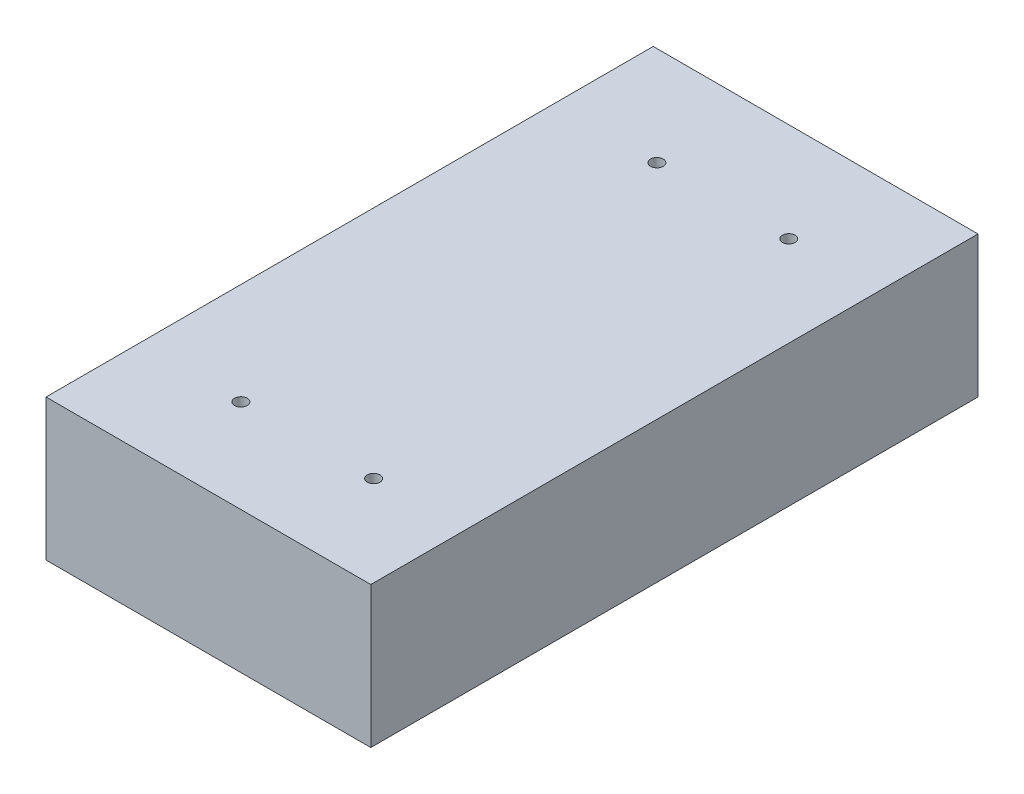
ISO-10303-21;
HEADER;
FILE_DESCRIPTION(('STEP AP214'),'2;1');
FILE_NAME('part.step','',(''),(''),'','','');
FILE_SCHEMA(('AUTOMOTIVE_DESIGN { 1 0 10303 214 1 1 1 1 }'));
ENDSEC;
DATA;
#1=APPLICATION_CONTEXT('core data for automotive mechanical design processes');
#2=APPLICATION_PROTOCOL_DEFINITION('international standard','automotive_design',2000,#1);
#3=PRODUCT_CONTEXT('',#1,'mechanical');
#4=PRODUCT('Part','Part','',(#3));
#5=PRODUCT_RELATED_PRODUCT_CATEGORY('part','',(#4));
#6=PRODUCT_DEFINITION_FORMATION('','',#4);
#7=PRODUCT_DEFINITION_CONTEXT('part definition',#1,'design');
#8=PRODUCT_DEFINITION('design','',#6,#7);
#9=PRODUCT_DEFINITION_SHAPE('','',#8);
#10=(LENGTH_UNIT() NAMED_UNIT(*) SI_UNIT(.MILLI.,.METRE.));
#11=(NAMED_UNIT(*) PLANE_ANGLE_UNIT() SI_UNIT($,.RADIAN.));
#12=(NAMED_UNIT(*) SI_UNIT($,.STERADIAN.) SOLID_ANGLE_UNIT());
#13=UNCERTAINTY_MEASURE_WITH_UNIT(LENGTH_MEASURE(1.E-05),#10,'distance_accuracy_value','');
#14=(GEOMETRIC_REPRESENTATION_CONTEXT(3) GLOBAL_UNCERTAINTY_ASSIGNED_CONTEXT((#13)) GLOBAL_UNIT_ASSIGNED_CONTEXT((#10,
#11,#12)) REPRESENTATION_CONTEXT('',''));
#15=CARTESIAN_POINT('',(0.,0.,0.));
#16=DIRECTION('',(0.,0.,1.));
#17=DIRECTION('',(1.,0.,0.));
#18=AXIS2_PLACEMENT_3D('',#15,#16,#17);
#19=CARTESIAN_POINT('',(57.5,50.,107.5));
#20=DIRECTION('',(-1.,0.,0.));
#21=DIRECTION('',(0.,0.,1.));
#22=AXIS2_PLACEMENT_3D('',#19,#20,#21);
#23=PLANE('',#22);
#24=DIRECTION('',(0.,0.,-1.));
#25=VECTOR('',#24,1.);
#26=CARTESIAN_POINT('',(57.5,0.,107.5));
#27=LINE('',#26,#25);
#28=CARTESIAN_POINT('',(57.5,0.,107.5));
#29=VERTEX_POINT('',#28);
#30=CARTESIAN_POINT('',(57.5,0.,-107.5));
#31=VERTEX_POINT('',#30);
#32=EDGE_CURVE('E102',#29,#31,#27,.T.);
#33=ORIENTED_EDGE('',*,*,#32,.T.);
#34=DIRECTION('',(0.,-1.,0.));
#35=VECTOR('',#34,1.);
#36=CARTESIAN_POINT('',(57.5,50.,-107.5));
#37=LINE('',#36,#35);
#38=CARTESIAN_POINT('',(57.5,50.,-107.5));
#39=VERTEX_POINT('',#38);
#40=EDGE_CURVE('E11',#39,#31,#37,.T.);
#41=ORIENTED_EDGE('',*,*,#40,.F.);
#42=DIRECTION('',(0.,0.,-1.));
#43=VECTOR('',#42,1.);
#44=CARTESIAN_POINT('',(57.5,50.,107.5));
#45=LINE('',#44,#43);
#46=CARTESIAN_POINT('',(57.5,50.,107.5));
#47=VERTEX_POINT('',#46);
#48=EDGE_CURVE('E90',#47,#39,#45,.T.);
#49=ORIENTED_EDGE('',*,*,#48,.F.);
#50=DIRECTION('',(0.,-1.,0.));
#51=VECTOR('',#50,1.);
#52=CARTESIAN_POINT('',(57.5,50.,107.5));
#53=LINE('',#52,#51);
#54=EDGE_CURVE('E98',#47,#29,#53,.T.);
#55=ORIENTED_EDGE('',*,*,#54,.T.);
#56=EDGE_LOOP('',(#33,#41,#49,#55));
#57=FACE_BOUND('',#56,.T.);
#58=ADVANCED_FACE('F39',(#57),#23,.F.);
#59=CARTESIAN_POINT('',(-57.5,50.,-107.5));
#60=DIRECTION('',(0.,0.,1.));
#61=DIRECTION('',(1.,0.,0.));
#62=AXIS2_PLACEMENT_3D('',#59,#60,#61);
#63=PLANE('',#62);
#64=DIRECTION('',(-1.,0.,0.));
#65=VECTOR('',#64,1.);
#66=CARTESIAN_POINT('',(-57.5,0.,-107.5));
#67=LINE('',#66,#65);
#68=CARTESIAN_POINT('',(-57.5,0.,-107.5));
#69=VERTEX_POINT('',#68);
#70=EDGE_CURVE('E94',#31,#69,#67,.T.);
#71=ORIENTED_EDGE('',*,*,#70,.T.);
#72=DIRECTION('',(0.,-1.,0.));
#73=VECTOR('',#72,1.);
#74=CARTESIAN_POINT('',(-57.5,50.,-107.5));
#75=LINE('',#74,#73);
#76=CARTESIAN_POINT('',(-57.5,50.,-107.5));
#77=VERTEX_POINT('',#76);
#78=EDGE_CURVE('E47',#77,#69,#75,.T.);
#79=ORIENTED_EDGE('',*,*,#78,.F.);
#80=DIRECTION('',(-1.,0.,0.));
#81=VECTOR('',#80,1.);
#82=CARTESIAN_POINT('',(-57.5,50.,-107.5));
#83=LINE('',#82,#81);
#84=EDGE_CURVE('E85',#39,#77,#83,.T.);
#85=ORIENTED_EDGE('',*,*,#84,.F.);
#86=ORIENTED_EDGE('',*,*,#40,.T.);
#87=EDGE_LOOP('',(#71,#79,#85,#86));
#88=FACE_BOUND('',#87,.T.);
#89=ADVANCED_FACE('F93',(#88),#63,.F.);
#90=CARTESIAN_POINT('',(-57.5,50.,107.5));
#91=DIRECTION('',(1.,0.,0.));
#92=DIRECTION('',(0.,0.,-1.));
#93=AXIS2_PLACEMENT_3D('',#90,#91,#92);
#94=PLANE('',#93);
#95=DIRECTION('',(0.,0.,1.));
#96=VECTOR('',#95,1.);
#97=CARTESIAN_POINT('',(-57.5,0.,107.5));
#98=LINE('',#97,#96);
#99=CARTESIAN_POINT('',(-57.5,0.,107.5));
#100=VERTEX_POINT('',#99);
#101=EDGE_CURVE('E72',#69,#100,#98,.T.);
#102=ORIENTED_EDGE('',*,*,#101,.T.);
#103=DIRECTION('',(0.,-1.,0.));
#104=VECTOR('',#103,1.);
#105=CARTESIAN_POINT('',(-57.5,50.,107.5));
#106=LINE('',#105,#104);
#107=CARTESIAN_POINT('',(-57.5,50.,107.5));
#108=VERTEX_POINT('',#107);
#109=EDGE_CURVE('E95',#108,#100,#106,.T.);
#110=ORIENTED_EDGE('',*,*,#109,.F.);
#111=DIRECTION('',(0.,0.,1.));
#112=VECTOR('',#111,1.);
#113=CARTESIAN_POINT('',(-57.5,50.,107.5));
#114=LINE('',#113,#112);
#115=EDGE_CURVE('E88',#77,#108,#114,.T.);
#116=ORIENTED_EDGE('',*,*,#115,.F.);
#117=ORIENTED_EDGE('',*,*,#78,.T.);
#118=EDGE_LOOP('',(#102,#110,#116,#117));
#119=FACE_BOUND('',#118,.T.);
#120=ADVANCED_FACE('F96',(#119),#94,.F.);
#121=CARTESIAN_POINT('',(-57.5,50.,107.5));
#122=DIRECTION('',(0.,0.,-1.));
#123=DIRECTION('',(-1.,0.,0.));
#124=AXIS2_PLACEMENT_3D('',#121,#122,#123);
#125=PLANE('',#124);
#126=DIRECTION('',(1.,0.,0.));
#127=VECTOR('',#126,1.);
#128=CARTESIAN_POINT('',(-57.5,0.,107.5));
#129=LINE('',#128,#127);
#130=EDGE_CURVE('E78',#100,#29,#129,.T.);
#131=ORIENTED_EDGE('',*,*,#130,.T.);
#132=ORIENTED_EDGE('',*,*,#54,.F.);
#133=DIRECTION('',(1.,0.,0.));
#134=VECTOR('',#133,1.);
#135=CARTESIAN_POINT('',(-57.5,50.,107.5));
#136=LINE('',#135,#134);
#137=EDGE_CURVE('E55',#108,#47,#136,.T.);
#138=ORIENTED_EDGE('',*,*,#137,.F.);
#139=ORIENTED_EDGE('',*,*,#109,.T.);
#140=EDGE_LOOP('',(#131,#132,#138,#139));
#141=FACE_BOUND('',#140,.T.);
#142=ADVANCED_FACE('F110',(#141),#125,.F.);
#143=CARTESIAN_POINT('',(0.,50.,0.));
#144=DIRECTION('',(0.,-1.,0.));
#145=DIRECTION('',(0.,0.,-1.));
#146=AXIS2_PLACEMENT_3D('',#143,#144,#145);
#147=PLANE('',#146);
#148=CARTESIAN_POINT('',(-21.5,50.,74.5));
#149=DIRECTION('',(0.,-1.,0.));
#150=DIRECTION('',(0.,0.,-1.));
#151=AXIS2_PLACEMENT_3D('',#148,#149,#150);
#152=CIRCLE('',#151,2.25);
#153=CARTESIAN_POINT('',(-21.5,50.,72.25));
#154=VERTEX_POINT('',#153);
#155=EDGE_CURVE('E119',#154,#154,#152,.T.);
#156=ORIENTED_EDGE('',*,*,#155,.T.);
#157=EDGE_LOOP('',(#156));
#158=FACE_BOUND('',#157,.T.);
#159=CARTESIAN_POINT('',(25.5,50.,-72.5));
#160=DIRECTION('',(0.,-1.,0.));
#161=DIRECTION('',(0.,0.,-1.));
#162=AXIS2_PLACEMENT_3D('',#159,#160,#161);
#163=CIRCLE('',#162,2.25);
#164=CARTESIAN_POINT('',(25.5,50.,-74.75));
#165=VERTEX_POINT('',#164);
#166=EDGE_CURVE('E125',#165,#165,#163,.T.);
#167=ORIENTED_EDGE('',*,*,#166,.T.);
#168=EDGE_LOOP('',(#167));
#169=FACE_BOUND('',#168,.T.);
#170=CARTESIAN_POINT('',(-21.2,50.,-72.5));
#171=DIRECTION('',(0.,-1.,0.));
#172=DIRECTION('',(0.,0.,-1.));
#173=AXIS2_PLACEMENT_3D('',#170,#171,#172);
#174=CIRCLE('',#173,2.25);
#175=CARTESIAN_POINT('',(-21.2,50.,-74.75));
#176=VERTEX_POINT('',#175);
#177=EDGE_CURVE('E126',#176,#176,#174,.T.);
#178=ORIENTED_EDGE('',*,*,#177,.T.);
#179=EDGE_LOOP('',(#178));
#180=FACE_BOUND('',#179,.T.);
#181=CARTESIAN_POINT('',(25.5,50.,74.5));
#182=DIRECTION('',(0.,-1.,0.));
#183=DIRECTION('',(0.,0.,-1.));
#184=AXIS2_PLACEMENT_3D('',#181,#182,#183);
#185=CIRCLE('',#184,2.25);
#186=CARTESIAN_POINT('',(25.5,50.,72.25));
#187=VERTEX_POINT('',#186);
#188=EDGE_CURVE('E105',#187,#187,#185,.T.);
#189=ORIENTED_EDGE('',*,*,#188,.T.);
#190=EDGE_LOOP('',(#189));
#191=FACE_BOUND('',#190,.T.);
#192=ORIENTED_EDGE('',*,*,#48,.T.);
#193=ORIENTED_EDGE('',*,*,#84,.T.);
#194=ORIENTED_EDGE('',*,*,#115,.T.);
#195=ORIENTED_EDGE('',*,*,#137,.T.);
#196=EDGE_LOOP('',(#192,#193,#194,#195));
#197=FACE_BOUND('',#196,.T.);
#198=ADVANCED_FACE('F86',(#158,#169,#180,#191,#197),#147,.F.);
#199=CARTESIAN_POINT('',(0.,0.,0.));
#200=DIRECTION('',(0.,-1.,0.));
#201=DIRECTION('',(0.,0.,-1.));
#202=AXIS2_PLACEMENT_3D('',#199,#200,#201);
#203=PLANE('',#202);
#204=CARTESIAN_POINT('',(-21.5,0.,74.5));
#205=DIRECTION('',(0.,-1.,0.));
#206=DIRECTION('',(0.,0.,-1.));
#207=AXIS2_PLACEMENT_3D('',#204,#205,#206);
#208=CIRCLE('',#207,2.25);
#209=CARTESIAN_POINT('',(-21.5,0.,72.25));
#210=VERTEX_POINT('',#209);
#211=EDGE_CURVE('E129',#210,#210,#208,.T.);
#212=ORIENTED_EDGE('',*,*,#211,.F.);
#213=EDGE_LOOP('',(#212));
#214=FACE_BOUND('',#213,.T.);
#215=CARTESIAN_POINT('',(25.5,0.,-72.5));
#216=DIRECTION('',(0.,-1.,0.));
#217=DIRECTION('',(0.,0.,-1.));
#218=AXIS2_PLACEMENT_3D('',#215,#216,#217);
#219=CIRCLE('',#218,2.25);
#220=CARTESIAN_POINT('',(25.5,0.,-74.75));
#221=VERTEX_POINT('',#220);
#222=EDGE_CURVE('E122',#221,#221,#219,.T.);
#223=ORIENTED_EDGE('',*,*,#222,.F.);
#224=EDGE_LOOP('',(#223));
#225=FACE_BOUND('',#224,.T.);
#226=CARTESIAN_POINT('',(-21.2,0.,-72.5));
#227=DIRECTION('',(0.,-1.,0.));
#228=DIRECTION('',(0.,0.,-1.));
#229=AXIS2_PLACEMENT_3D('',#226,#227,#228);
#230=CIRCLE('',#229,2.25);
#231=CARTESIAN_POINT('',(-21.2,0.,-74.75));
#232=VERTEX_POINT('',#231);
#233=EDGE_CURVE('E134',#232,#232,#230,.T.);
#234=ORIENTED_EDGE('',*,*,#233,.F.);
#235=EDGE_LOOP('',(#234));
#236=FACE_BOUND('',#235,.T.);
#237=CARTESIAN_POINT('',(25.5,0.,74.5));
#238=DIRECTION('',(0.,-1.,0.));
#239=DIRECTION('',(0.,0.,-1.));
#240=AXIS2_PLACEMENT_3D('',#237,#238,#239);
#241=CIRCLE('',#240,2.25);
#242=CARTESIAN_POINT('',(25.5,0.,72.25));
#243=VERTEX_POINT('',#242);
#244=EDGE_CURVE('E116',#243,#243,#241,.T.);
#245=ORIENTED_EDGE('',*,*,#244,.F.);
#246=EDGE_LOOP('',(#245));
#247=FACE_BOUND('',#246,.T.);
#248=ORIENTED_EDGE('',*,*,#32,.F.);
#249=ORIENTED_EDGE('',*,*,#130,.F.);
#250=ORIENTED_EDGE('',*,*,#101,.F.);
#251=ORIENTED_EDGE('',*,*,#70,.F.);
#252=EDGE_LOOP('',(#248,#249,#250,#251));
#253=FACE_BOUND('',#252,.T.);
#254=ADVANCED_FACE('F113',(#214,#225,#236,#247,#253),#203,.T.);
#255=CARTESIAN_POINT('',(25.5,50.,74.5));
#256=DIRECTION('',(0.,-1.,0.));
#257=DIRECTION('',(0.,0.,-1.));
#258=AXIS2_PLACEMENT_3D('',#255,#256,#257);
#259=CYLINDRICAL_SURFACE('',#258,2.25);
#260=ORIENTED_EDGE('',*,*,#188,.F.);
#261=EDGE_LOOP('',(#260));
#262=FACE_BOUND('',#261,.T.);
#263=ORIENTED_EDGE('',*,*,#244,.T.);
#264=EDGE_LOOP('',(#263));
#265=FACE_BOUND('',#264,.T.);
#266=ADVANCED_FACE('F146',(#262,#265),#259,.F.);
#267=CARTESIAN_POINT('',(-21.2,50.,-72.5));
#268=DIRECTION('',(0.,-1.,0.));
#269=DIRECTION('',(0.,0.,-1.));
#270=AXIS2_PLACEMENT_3D('',#267,#268,#269);
#271=CYLINDRICAL_SURFACE('',#270,2.25);
#272=ORIENTED_EDGE('',*,*,#177,.F.);
#273=EDGE_LOOP('',(#272));
#274=FACE_BOUND('',#273,.T.);
#275=ORIENTED_EDGE('',*,*,#233,.T.);
#276=EDGE_LOOP('',(#275));
#277=FACE_BOUND('',#276,.T.);
#278=ADVANCED_FACE('F142',(#274,#277),#271,.F.);
#279=CARTESIAN_POINT('',(25.5,50.,-72.5));
#280=DIRECTION('',(0.,-1.,0.));
#281=DIRECTION('',(0.,0.,-1.));
#282=AXIS2_PLACEMENT_3D('',#279,#280,#281);
#283=CYLINDRICAL_SURFACE('',#282,2.25);
#284=ORIENTED_EDGE('',*,*,#166,.F.);
#285=EDGE_LOOP('',(#284));
#286=FACE_BOUND('',#285,.T.);
#287=ORIENTED_EDGE('',*,*,#222,.T.);
#288=EDGE_LOOP('',(#287));
#289=FACE_BOUND('',#288,.T.);
#290=ADVANCED_FACE('F145',(#286,#289),#283,.F.);
#291=CARTESIAN_POINT('',(-21.5,50.,74.5));
#292=DIRECTION('',(0.,-1.,0.));
#293=DIRECTION('',(0.,0.,-1.));
#294=AXIS2_PLACEMENT_3D('',#291,#292,#293);
#295=CYLINDRICAL_SURFACE('',#294,2.25);
#296=ORIENTED_EDGE('',*,*,#155,.F.);
#297=EDGE_LOOP('',(#296));
#298=FACE_BOUND('',#297,.T.);
#299=ORIENTED_EDGE('',*,*,#211,.T.);
#300=EDGE_LOOP('',(#299));
#301=FACE_BOUND('',#300,.T.);
#302=ADVANCED_FACE('F186',(#298,#301),#295,.F.);
#303=CLOSED_SHELL('',(#58,#89,#120,#142,#198,#254,#266,#278,#290,#302));
#304=MANIFOLD_SOLID_BREP('B2',#303);
#305=ADVANCED_BREP_SHAPE_REPRESENTATION('',(#18,#304),#14);
#306=SHAPE_DEFINITION_REPRESENTATION(#9,#305);
ENDSEC;
END-ISO-10303-21;
